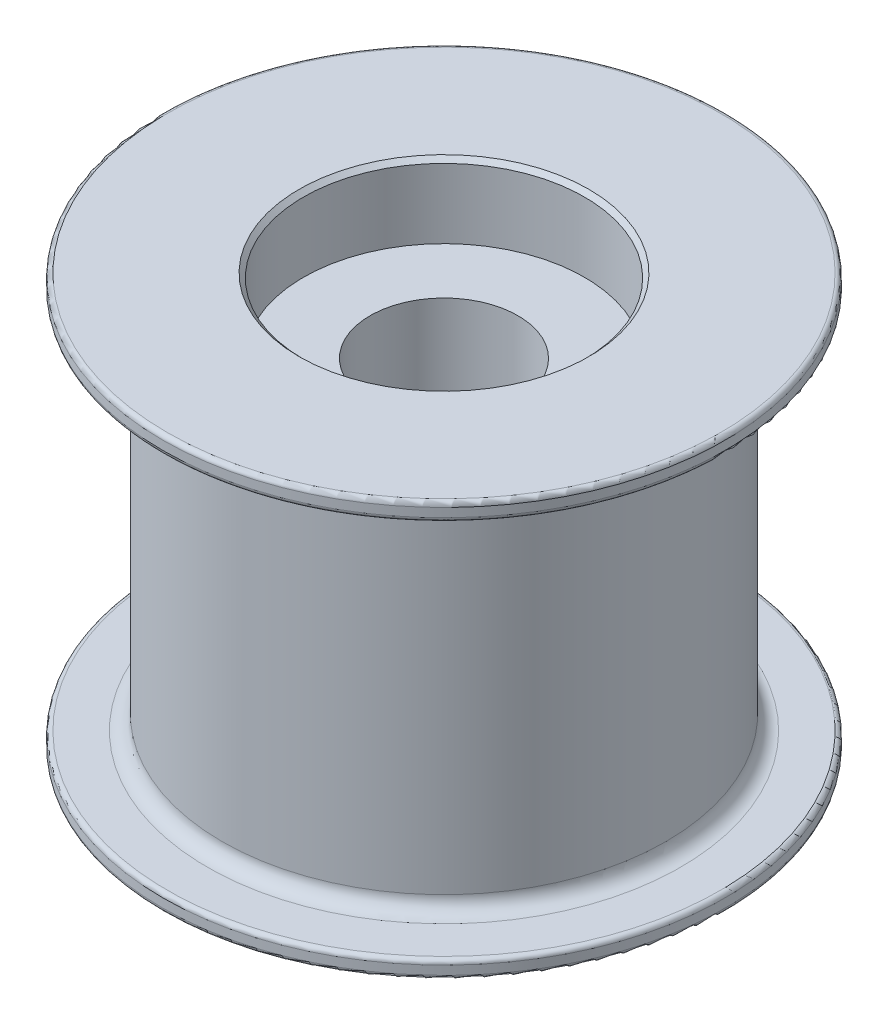
ISO-10303-21;
HEADER;
FILE_DESCRIPTION(('STEP AP214'),'2;1');
FILE_NAME('part.step','',(''),(''),'','','');
FILE_SCHEMA(('AUTOMOTIVE_DESIGN { 1 0 10303 214 1 1 1 1 }'));
ENDSEC;
DATA;
#1=APPLICATION_CONTEXT('core data for automotive mechanical design processes');
#2=APPLICATION_PROTOCOL_DEFINITION('international standard','automotive_design',2000,#1);
#3=PRODUCT_CONTEXT('',#1,'mechanical');
#4=PRODUCT('Part','Part','',(#3));
#5=PRODUCT_RELATED_PRODUCT_CATEGORY('part','',(#4));
#6=PRODUCT_DEFINITION_FORMATION('','',#4);
#7=PRODUCT_DEFINITION_CONTEXT('part definition',#1,'design');
#8=PRODUCT_DEFINITION('design','',#6,#7);
#9=PRODUCT_DEFINITION_SHAPE('','',#8);
#10=(LENGTH_UNIT() NAMED_UNIT(*) SI_UNIT(.MILLI.,.METRE.));
#11=(NAMED_UNIT(*) PLANE_ANGLE_UNIT() SI_UNIT($,.RADIAN.));
#12=(NAMED_UNIT(*) SI_UNIT($,.STERADIAN.) SOLID_ANGLE_UNIT());
#13=UNCERTAINTY_MEASURE_WITH_UNIT(LENGTH_MEASURE(1.E-05),#10,'distance_accuracy_value','');
#14=(GEOMETRIC_REPRESENTATION_CONTEXT(3) GLOBAL_UNCERTAINTY_ASSIGNED_CONTEXT((#13)) GLOBAL_UNIT_ASSIGNED_CONTEXT((#10,
#11,#12)) REPRESENTATION_CONTEXT('',''));
#15=CARTESIAN_POINT('',(0.,0.,0.));
#16=DIRECTION('',(0.,0.,1.));
#17=DIRECTION('',(1.,0.,0.));
#18=AXIS2_PLACEMENT_3D('',#15,#16,#17);
#19=CARTESIAN_POINT('',(0.,11.9428571428571,0.));
#20=DIRECTION('',(0.,1.,0.));
#21=DIRECTION('',(0.,0.,1.));
#22=AXIS2_PLACEMENT_3D('',#19,#20,#21);
#23=CYLINDRICAL_SURFACE('',#22,9.5);
#24=CARTESIAN_POINT('',(0.,13.7,0.));
#25=DIRECTION('',(0.,1.,0.));
#26=DIRECTION('',(0.,0.,1.));
#27=AXIS2_PLACEMENT_3D('',#24,#25,#26);
#28=CIRCLE('',#27,9.5);
#29=CARTESIAN_POINT('',(0.,13.7,9.5));
#30=VERTEX_POINT('',#29);
#31=EDGE_CURVE('E53',#30,#30,#28,.T.);
#32=ORIENTED_EDGE('',*,*,#31,.T.);
#33=EDGE_LOOP('',(#32));
#34=FACE_BOUND('',#33,.T.);
#35=CARTESIAN_POINT('',(0.,9.,0.));
#36=DIRECTION('',(0.,1.,0.));
#37=DIRECTION('',(0.,0.,1.));
#38=AXIS2_PLACEMENT_3D('',#35,#36,#37);
#39=CIRCLE('',#38,9.5);
#40=CARTESIAN_POINT('',(0.,9.,9.5));
#41=VERTEX_POINT('',#40);
#42=EDGE_CURVE('E65',#41,#41,#39,.T.);
#43=ORIENTED_EDGE('',*,*,#42,.F.);
#44=EDGE_LOOP('',(#43));
#45=FACE_BOUND('',#44,.T.);
#46=ADVANCED_FACE('F30',(#34,#45),#23,.F.);
#47=CARTESIAN_POINT('',(-9.5,14.,0.));
#48=DIRECTION('',(0.,1.,0.));
#49=DIRECTION('',(0.,0.,1.));
#50=AXIS2_PLACEMENT_3D('',#47,#48,#49);
#51=PLANE('',#50);
#52=CARTESIAN_POINT('',(0.,14.,0.));
#53=DIRECTION('',(0.,1.,0.));
#54=DIRECTION('',(0.,0.,1.));
#55=AXIS2_PLACEMENT_3D('',#52,#53,#54);
#56=CIRCLE('',#55,18.7);
#57=CARTESIAN_POINT('',(0.,14.,18.7));
#58=VERTEX_POINT('',#57);
#59=EDGE_CURVE('E45',#58,#58,#56,.T.);
#60=ORIENTED_EDGE('',*,*,#59,.T.);
#61=EDGE_LOOP('',(#60));
#62=FACE_BOUND('',#61,.T.);
#63=CARTESIAN_POINT('',(0.,14.,0.));
#64=DIRECTION('',(0.,1.,0.));
#65=DIRECTION('',(0.,0.,1.));
#66=AXIS2_PLACEMENT_3D('',#63,#64,#65);
#67=CIRCLE('',#66,9.80000000000001);
#68=CARTESIAN_POINT('',(0.,14.,9.80000000000001));
#69=VERTEX_POINT('',#68);
#70=EDGE_CURVE('E50',#69,#69,#67,.F.);
#71=ORIENTED_EDGE('',*,*,#70,.T.);
#72=EDGE_LOOP('',(#71));
#73=FACE_BOUND('',#72,.T.);
#74=ADVANCED_FACE('F126',(#62,#73),#51,.T.);
#75=CARTESIAN_POINT('',(0.,11.9428571428571,0.));
#76=DIRECTION('',(0.,1.,0.));
#77=DIRECTION('',(0.,0.,1.));
#78=AXIS2_PLACEMENT_3D('',#75,#76,#77);
#79=CYLINDRICAL_SURFACE('',#78,19.);
#80=CARTESIAN_POINT('',(0.,13.7,0.));
#81=DIRECTION('',(0.,1.,0.));
#82=DIRECTION('',(0.,0.,1.));
#83=AXIS2_PLACEMENT_3D('',#80,#81,#82);
#84=CIRCLE('',#83,19.);
#85=CARTESIAN_POINT('',(0.,13.7,19.));
#86=VERTEX_POINT('',#85);
#87=EDGE_CURVE('E37',#86,#86,#84,.F.);
#88=ORIENTED_EDGE('',*,*,#87,.T.);
#89=EDGE_LOOP('',(#88));
#90=FACE_BOUND('',#89,.T.);
#91=CARTESIAN_POINT('',(0.,13.1,0.));
#92=DIRECTION('',(0.,-1.,0.));
#93=DIRECTION('',(0.,0.,-1.));
#94=AXIS2_PLACEMENT_3D('',#91,#92,#93);
#95=CIRCLE('',#94,19.);
#96=CARTESIAN_POINT('',(0.,13.1,-19.));
#97=VERTEX_POINT('',#96);
#98=EDGE_CURVE('E41',#97,#97,#95,.F.);
#99=ORIENTED_EDGE('',*,*,#98,.T.);
#100=EDGE_LOOP('',(#99));
#101=FACE_BOUND('',#100,.T.);
#102=ADVANCED_FACE('F132',(#90,#101),#79,.T.);
#103=CARTESIAN_POINT('',(-19.,12.8,0.));
#104=DIRECTION('',(0.,-1.,0.));
#105=DIRECTION('',(0.,0.,-1.));
#106=AXIS2_PLACEMENT_3D('',#103,#104,#105);
#107=PLANE('',#106);
#108=CARTESIAN_POINT('',(0.,12.8,0.));
#109=DIRECTION('',(0.,-1.,0.));
#110=DIRECTION('',(0.,0.,-1.));
#111=AXIS2_PLACEMENT_3D('',#108,#109,#110);
#112=CIRCLE('',#111,18.7);
#113=CARTESIAN_POINT('',(0.,12.8,-18.7));
#114=VERTEX_POINT('',#113);
#115=EDGE_CURVE('E10',#114,#114,#112,.T.);
#116=ORIENTED_EDGE('',*,*,#115,.T.);
#117=EDGE_LOOP('',(#116));
#118=FACE_BOUND('',#117,.T.);
#119=CARTESIAN_POINT('',(0.,12.8,0.));
#120=DIRECTION('',(0.,-1.,0.));
#121=DIRECTION('',(0.,0.,-1.));
#122=AXIS2_PLACEMENT_3D('',#119,#120,#121);
#123=CIRCLE('',#122,16.);
#124=CARTESIAN_POINT('',(0.,12.8,-16.));
#125=VERTEX_POINT('',#124);
#126=EDGE_CURVE('E59',#125,#125,#123,.F.);
#127=ORIENTED_EDGE('',*,*,#126,.T.);
#128=EDGE_LOOP('',(#127));
#129=FACE_BOUND('',#128,.T.);
#130=ADVANCED_FACE('F122',(#118,#129),#107,.T.);
#131=CARTESIAN_POINT('',(0.,11.9428571428571,0.));
#132=DIRECTION('',(0.,1.,0.));
#133=DIRECTION('',(0.,0.,1.));
#134=AXIS2_PLACEMENT_3D('',#131,#132,#133);
#135=CYLINDRICAL_SURFACE('',#134,15.);
#136=CARTESIAN_POINT('',(0.,11.8,0.));
#137=DIRECTION('',(0.,-1.,0.));
#138=DIRECTION('',(0.,0.,-1.));
#139=AXIS2_PLACEMENT_3D('',#136,#137,#138);
#140=CIRCLE('',#139,15.);
#141=CARTESIAN_POINT('',(0.,11.8,-15.));
#142=VERTEX_POINT('',#141);
#143=EDGE_CURVE('E56',#142,#142,#140,.T.);
#144=ORIENTED_EDGE('',*,*,#143,.T.);
#145=EDGE_LOOP('',(#144));
#146=FACE_BOUND('',#145,.T.);
#147=CARTESIAN_POINT('',(0.,-11.8,0.));
#148=DIRECTION('',(0.,-1.,0.));
#149=DIRECTION('',(0.,0.,-1.));
#150=AXIS2_PLACEMENT_3D('',#147,#148,#149);
#151=CIRCLE('',#150,15.);
#152=CARTESIAN_POINT('',(0.,-11.8,-15.));
#153=VERTEX_POINT('',#152);
#154=EDGE_CURVE('E86',#153,#153,#151,.T.);
#155=ORIENTED_EDGE('',*,*,#154,.F.);
#156=EDGE_LOOP('',(#155));
#157=FACE_BOUND('',#156,.T.);
#158=ADVANCED_FACE('F112',(#146,#157),#135,.T.);
#159=CARTESIAN_POINT('',(0.,11.9428571428571,0.));
#160=DIRECTION('',(0.,1.,0.));
#161=DIRECTION('',(0.,0.,1.));
#162=AXIS2_PLACEMENT_3D('',#159,#160,#161);
#163=CYLINDRICAL_SURFACE('',#162,5.);
#164=CARTESIAN_POINT('',(0.,9.,0.));
#165=DIRECTION('',(0.,1.,0.));
#166=DIRECTION('',(0.,0.,1.));
#167=AXIS2_PLACEMENT_3D('',#164,#165,#166);
#168=CIRCLE('',#167,5.);
#169=CARTESIAN_POINT('',(0.,9.,5.));
#170=VERTEX_POINT('',#169);
#171=EDGE_CURVE('E62',#170,#170,#168,.T.);
#172=ORIENTED_EDGE('',*,*,#171,.T.);
#173=EDGE_LOOP('',(#172));
#174=FACE_BOUND('',#173,.T.);
#175=CARTESIAN_POINT('',(0.,-9.,0.));
#176=DIRECTION('',(0.,1.,0.));
#177=DIRECTION('',(0.,0.,1.));
#178=AXIS2_PLACEMENT_3D('',#175,#176,#177);
#179=CIRCLE('',#178,5.);
#180=CARTESIAN_POINT('',(0.,-9.,5.));
#181=VERTEX_POINT('',#180);
#182=EDGE_CURVE('E92',#181,#181,#179,.T.);
#183=ORIENTED_EDGE('',*,*,#182,.F.);
#184=EDGE_LOOP('',(#183));
#185=FACE_BOUND('',#184,.T.);
#186=ADVANCED_FACE('F109',(#174,#185),#163,.F.);
#187=CARTESIAN_POINT('',(-5.,9.,0.));
#188=DIRECTION('',(0.,1.,0.));
#189=DIRECTION('',(0.,0.,1.));
#190=AXIS2_PLACEMENT_3D('',#187,#188,#189);
#191=PLANE('',#190);
#192=ORIENTED_EDGE('',*,*,#42,.T.);
#193=EDGE_LOOP('',(#192));
#194=FACE_BOUND('',#193,.T.);
#195=ORIENTED_EDGE('',*,*,#171,.F.);
#196=EDGE_LOOP('',(#195));
#197=FACE_BOUND('',#196,.T.);
#198=ADVANCED_FACE('F111',(#194,#197),#191,.T.);
#199=CARTESIAN_POINT('',(0.,11.8,0.));
#200=DIRECTION('',(0.,-1.,0.));
#201=DIRECTION('',(0.,0.,-1.));
#202=AXIS2_PLACEMENT_3D('',#199,#200,#201);
#203=TOROIDAL_SURFACE('',#202,16.,1.);
#204=ORIENTED_EDGE('',*,*,#143,.F.);
#205=EDGE_LOOP('',(#204));
#206=FACE_BOUND('',#205,.T.);
#207=ORIENTED_EDGE('',*,*,#126,.F.);
#208=EDGE_LOOP('',(#207));
#209=FACE_BOUND('',#208,.T.);
#210=ADVANCED_FACE('F119',(#206,#209),#203,.F.);
#211=CARTESIAN_POINT('',(0.,13.7,0.));
#212=DIRECTION('',(0.,1.,0.));
#213=DIRECTION('',(0.,0.,1.));
#214=AXIS2_PLACEMENT_3D('',#211,#212,#213);
#215=CONICAL_SURFACE('',#214,9.5,0.785398163397445);
#216=ORIENTED_EDGE('',*,*,#70,.F.);
#217=EDGE_LOOP('',(#216));
#218=FACE_BOUND('',#217,.T.);
#219=ORIENTED_EDGE('',*,*,#31,.F.);
#220=EDGE_LOOP('',(#219));
#221=FACE_BOUND('',#220,.T.);
#222=ADVANCED_FACE('F140',(#218,#221),#215,.F.);
#223=CARTESIAN_POINT('',(0.,13.7,0.));
#224=DIRECTION('',(0.,1.,0.));
#225=DIRECTION('',(0.,0.,1.));
#226=AXIS2_PLACEMENT_3D('',#223,#224,#225);
#227=TOROIDAL_SURFACE('',#226,18.7,0.3);
#228=ORIENTED_EDGE('',*,*,#87,.F.);
#229=EDGE_LOOP('',(#228));
#230=FACE_BOUND('',#229,.T.);
#231=ORIENTED_EDGE('',*,*,#59,.F.);
#232=EDGE_LOOP('',(#231));
#233=FACE_BOUND('',#232,.T.);
#234=ADVANCED_FACE('F143',(#230,#233),#227,.T.);
#235=CARTESIAN_POINT('',(0.,13.1,0.));
#236=DIRECTION('',(0.,-1.,0.));
#237=DIRECTION('',(0.,0.,-1.));
#238=AXIS2_PLACEMENT_3D('',#235,#236,#237);
#239=TOROIDAL_SURFACE('',#238,18.7,0.3);
#240=ORIENTED_EDGE('',*,*,#115,.F.);
#241=EDGE_LOOP('',(#240));
#242=FACE_BOUND('',#241,.T.);
#243=ORIENTED_EDGE('',*,*,#98,.F.);
#244=EDGE_LOOP('',(#243));
#245=FACE_BOUND('',#244,.T.);
#246=ADVANCED_FACE('F32',(#242,#245),#239,.T.);
#247=CARTESIAN_POINT('',(0.,-11.9428571428571,0.));
#248=DIRECTION('',(0.,-1.,0.));
#249=DIRECTION('',(0.,0.,1.));
#250=AXIS2_PLACEMENT_3D('',#247,#248,#249);
#251=CYLINDRICAL_SURFACE('',#250,9.5);
#252=CARTESIAN_POINT('',(0.,-13.7,0.));
#253=DIRECTION('',(0.,1.,0.));
#254=DIRECTION('',(0.,0.,1.));
#255=AXIS2_PLACEMENT_3D('',#252,#253,#254);
#256=CIRCLE('',#255,9.5);
#257=CARTESIAN_POINT('',(0.,-13.7,9.5));
#258=VERTEX_POINT('',#257);
#259=EDGE_CURVE('E83',#258,#258,#256,.T.);
#260=ORIENTED_EDGE('',*,*,#259,.F.);
#261=EDGE_LOOP('',(#260));
#262=FACE_BOUND('',#261,.T.);
#263=CARTESIAN_POINT('',(0.,-9.,0.));
#264=DIRECTION('',(0.,1.,0.));
#265=DIRECTION('',(0.,0.,1.));
#266=AXIS2_PLACEMENT_3D('',#263,#264,#265);
#267=CIRCLE('',#266,9.5);
#268=CARTESIAN_POINT('',(0.,-9.,9.5));
#269=VERTEX_POINT('',#268);
#270=EDGE_CURVE('E95',#269,#269,#267,.T.);
#271=ORIENTED_EDGE('',*,*,#270,.T.);
#272=EDGE_LOOP('',(#271));
#273=FACE_BOUND('',#272,.T.);
#274=ADVANCED_FACE('F99',(#262,#273),#251,.F.);
#275=CARTESIAN_POINT('',(-9.5,-14.,0.));
#276=DIRECTION('',(0.,-1.,0.));
#277=DIRECTION('',(0.,0.,1.));
#278=AXIS2_PLACEMENT_3D('',#275,#276,#277);
#279=PLANE('',#278);
#280=CARTESIAN_POINT('',(0.,-14.,0.));
#281=DIRECTION('',(0.,1.,0.));
#282=DIRECTION('',(0.,0.,1.));
#283=AXIS2_PLACEMENT_3D('',#280,#281,#282);
#284=CIRCLE('',#283,18.7);
#285=CARTESIAN_POINT('',(0.,-14.,18.7));
#286=VERTEX_POINT('',#285);
#287=EDGE_CURVE('E77',#286,#286,#284,.T.);
#288=ORIENTED_EDGE('',*,*,#287,.F.);
#289=EDGE_LOOP('',(#288));
#290=FACE_BOUND('',#289,.T.);
#291=CARTESIAN_POINT('',(0.,-14.,0.));
#292=DIRECTION('',(0.,1.,0.));
#293=DIRECTION('',(0.,0.,1.));
#294=AXIS2_PLACEMENT_3D('',#291,#292,#293);
#295=CIRCLE('',#294,9.80000000000001);
#296=CARTESIAN_POINT('',(0.,-14.,9.80000000000001));
#297=VERTEX_POINT('',#296);
#298=EDGE_CURVE('E80',#297,#297,#295,.F.);
#299=ORIENTED_EDGE('',*,*,#298,.F.);
#300=EDGE_LOOP('',(#299));
#301=FACE_BOUND('',#300,.T.);
#302=ADVANCED_FACE('F160',(#290,#301),#279,.T.);
#303=CARTESIAN_POINT('',(0.,-11.9428571428571,0.));
#304=DIRECTION('',(0.,-1.,0.));
#305=DIRECTION('',(0.,0.,1.));
#306=AXIS2_PLACEMENT_3D('',#303,#304,#305);
#307=CYLINDRICAL_SURFACE('',#306,19.);
#308=CARTESIAN_POINT('',(0.,-13.7,0.));
#309=DIRECTION('',(0.,1.,0.));
#310=DIRECTION('',(0.,0.,1.));
#311=AXIS2_PLACEMENT_3D('',#308,#309,#310);
#312=CIRCLE('',#311,19.);
#313=CARTESIAN_POINT('',(0.,-13.7,19.));
#314=VERTEX_POINT('',#313);
#315=EDGE_CURVE('E71',#314,#314,#312,.F.);
#316=ORIENTED_EDGE('',*,*,#315,.F.);
#317=EDGE_LOOP('',(#316));
#318=FACE_BOUND('',#317,.T.);
#319=CARTESIAN_POINT('',(0.,-13.1,0.));
#320=DIRECTION('',(0.,-1.,0.));
#321=DIRECTION('',(0.,0.,-1.));
#322=AXIS2_PLACEMENT_3D('',#319,#320,#321);
#323=CIRCLE('',#322,19.);
#324=CARTESIAN_POINT('',(0.,-13.1,-19.));
#325=VERTEX_POINT('',#324);
#326=EDGE_CURVE('E74',#325,#325,#323,.F.);
#327=ORIENTED_EDGE('',*,*,#326,.F.);
#328=EDGE_LOOP('',(#327));
#329=FACE_BOUND('',#328,.T.);
#330=ADVANCED_FACE('F205',(#318,#329),#307,.T.);
#331=CARTESIAN_POINT('',(-19.,-12.8,0.));
#332=DIRECTION('',(0.,1.,0.));
#333=DIRECTION('',(0.,0.,-1.));
#334=AXIS2_PLACEMENT_3D('',#331,#332,#333);
#335=PLANE('',#334);
#336=CARTESIAN_POINT('',(0.,-12.8,0.));
#337=DIRECTION('',(0.,-1.,0.));
#338=DIRECTION('',(0.,0.,-1.));
#339=AXIS2_PLACEMENT_3D('',#336,#337,#338);
#340=CIRCLE('',#339,18.7);
#341=CARTESIAN_POINT('',(0.,-12.8,-18.7));
#342=VERTEX_POINT('',#341);
#343=EDGE_CURVE('E68',#342,#342,#340,.T.);
#344=ORIENTED_EDGE('',*,*,#343,.F.);
#345=EDGE_LOOP('',(#344));
#346=FACE_BOUND('',#345,.T.);
#347=CARTESIAN_POINT('',(0.,-12.8,0.));
#348=DIRECTION('',(0.,-1.,0.));
#349=DIRECTION('',(0.,0.,-1.));
#350=AXIS2_PLACEMENT_3D('',#347,#348,#349);
#351=CIRCLE('',#350,16.);
#352=CARTESIAN_POINT('',(0.,-12.8,-16.));
#353=VERTEX_POINT('',#352);
#354=EDGE_CURVE('E89',#353,#353,#351,.F.);
#355=ORIENTED_EDGE('',*,*,#354,.F.);
#356=EDGE_LOOP('',(#355));
#357=FACE_BOUND('',#356,.T.);
#358=ADVANCED_FACE('F105',(#346,#357),#335,.T.);
#359=CARTESIAN_POINT('',(-5.,-9.,0.));
#360=DIRECTION('',(0.,-1.,0.));
#361=DIRECTION('',(0.,0.,1.));
#362=AXIS2_PLACEMENT_3D('',#359,#360,#361);
#363=PLANE('',#362);
#364=ORIENTED_EDGE('',*,*,#270,.F.);
#365=EDGE_LOOP('',(#364));
#366=FACE_BOUND('',#365,.T.);
#367=ORIENTED_EDGE('',*,*,#182,.T.);
#368=EDGE_LOOP('',(#367));
#369=FACE_BOUND('',#368,.T.);
#370=ADVANCED_FACE('F101',(#366,#369),#363,.T.);
#371=CARTESIAN_POINT('',(0.,-11.8,0.));
#372=DIRECTION('',(0.,1.,0.));
#373=DIRECTION('',(0.,0.,-1.));
#374=AXIS2_PLACEMENT_3D('',#371,#372,#373);
#375=TOROIDAL_SURFACE('',#374,16.,1.);
#376=ORIENTED_EDGE('',*,*,#154,.T.);
#377=EDGE_LOOP('',(#376));
#378=FACE_BOUND('',#377,.T.);
#379=ORIENTED_EDGE('',*,*,#354,.T.);
#380=EDGE_LOOP('',(#379));
#381=FACE_BOUND('',#380,.T.);
#382=ADVANCED_FACE('F104',(#378,#381),#375,.F.);
#383=CARTESIAN_POINT('',(0.,-13.7,0.));
#384=DIRECTION('',(0.,-1.,0.));
#385=DIRECTION('',(0.,0.,1.));
#386=AXIS2_PLACEMENT_3D('',#383,#384,#385);
#387=CONICAL_SURFACE('',#386,9.5,0.785398163397445);
#388=ORIENTED_EDGE('',*,*,#298,.T.);
#389=EDGE_LOOP('',(#388));
#390=FACE_BOUND('',#389,.T.);
#391=ORIENTED_EDGE('',*,*,#259,.T.);
#392=EDGE_LOOP('',(#391));
#393=FACE_BOUND('',#392,.T.);
#394=ADVANCED_FACE('F239',(#390,#393),#387,.F.);
#395=CARTESIAN_POINT('',(0.,-13.7,0.));
#396=DIRECTION('',(0.,-1.,0.));
#397=DIRECTION('',(0.,0.,1.));
#398=AXIS2_PLACEMENT_3D('',#395,#396,#397);
#399=TOROIDAL_SURFACE('',#398,18.7,0.3);
#400=ORIENTED_EDGE('',*,*,#315,.T.);
#401=EDGE_LOOP('',(#400));
#402=FACE_BOUND('',#401,.T.);
#403=ORIENTED_EDGE('',*,*,#287,.T.);
#404=EDGE_LOOP('',(#403));
#405=FACE_BOUND('',#404,.T.);
#406=ADVANCED_FACE('F249',(#402,#405),#399,.T.);
#407=CARTESIAN_POINT('',(0.,-13.1,0.));
#408=DIRECTION('',(0.,1.,0.));
#409=DIRECTION('',(0.,0.,-1.));
#410=AXIS2_PLACEMENT_3D('',#407,#408,#409);
#411=TOROIDAL_SURFACE('',#410,18.7,0.3);
#412=ORIENTED_EDGE('',*,*,#343,.T.);
#413=EDGE_LOOP('',(#412));
#414=FACE_BOUND('',#413,.T.);
#415=ORIENTED_EDGE('',*,*,#326,.T.);
#416=EDGE_LOOP('',(#415));
#417=FACE_BOUND('',#416,.T.);
#418=ADVANCED_FACE('F259',(#414,#417),#411,.T.);
#419=CLOSED_SHELL('',(#46,#74,#102,#130,#158,#186,#198,#210,#222,#234,#246,#274,#302,#330,#358,
#370,#382,#394,#406,#418));
#420=MANIFOLD_SOLID_BREP('B2',#419);
#421=ADVANCED_BREP_SHAPE_REPRESENTATION('',(#18,#420),#14);
#422=SHAPE_DEFINITION_REPRESENTATION(#9,#421);
ENDSEC;
END-ISO-10303-21;
